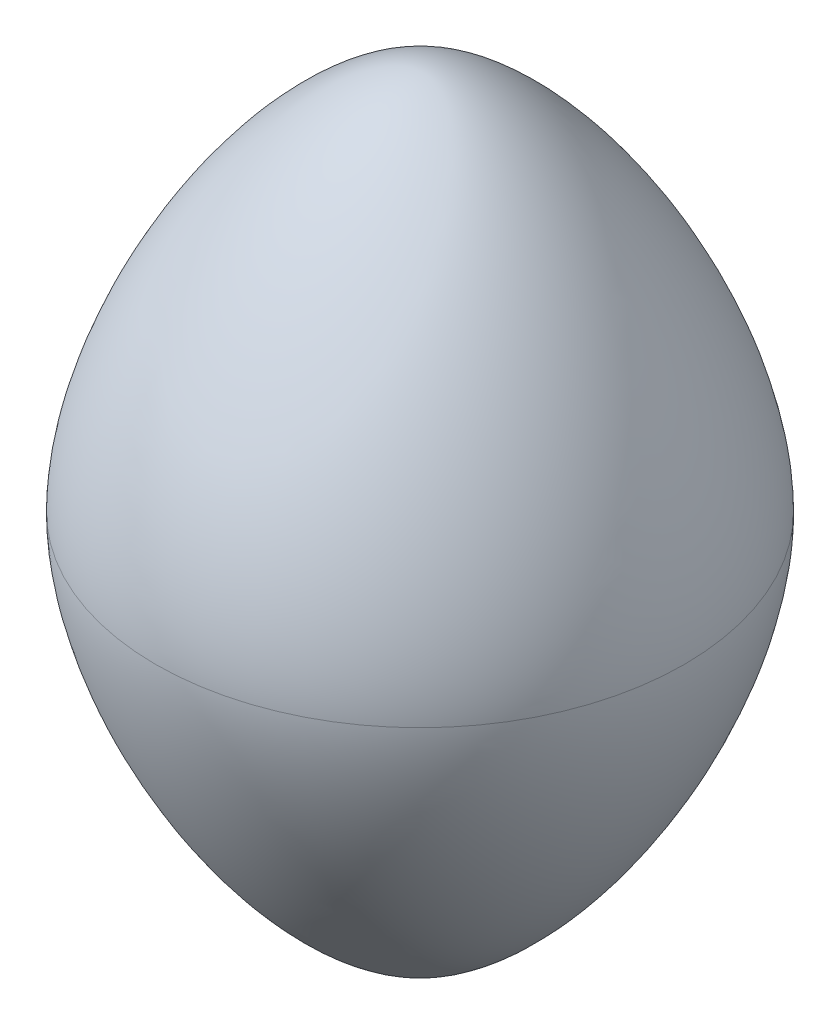
ISO-10303-21;
HEADER;
FILE_DESCRIPTION(('STEP AP214'),'2;1');
FILE_NAME('part.step','',(''),(''),'','','');
FILE_SCHEMA(('AUTOMOTIVE_DESIGN { 1 0 10303 214 1 1 1 1 }'));
ENDSEC;
DATA;
#1=APPLICATION_CONTEXT('core data for automotive mechanical design processes');
#2=APPLICATION_PROTOCOL_DEFINITION('international standard','automotive_design',2000,#1);
#3=PRODUCT_CONTEXT('',#1,'mechanical');
#4=PRODUCT('Part','Part','',(#3));
#5=PRODUCT_RELATED_PRODUCT_CATEGORY('part','',(#4));
#6=PRODUCT_DEFINITION_FORMATION('','',#4);
#7=PRODUCT_DEFINITION_CONTEXT('part definition',#1,'design');
#8=PRODUCT_DEFINITION('design','',#6,#7);
#9=PRODUCT_DEFINITION_SHAPE('','',#8);
#10=(LENGTH_UNIT() NAMED_UNIT(*) SI_UNIT(.MILLI.,.METRE.));
#11=(NAMED_UNIT(*) PLANE_ANGLE_UNIT() SI_UNIT($,.RADIAN.));
#12=(NAMED_UNIT(*) SI_UNIT($,.STERADIAN.) SOLID_ANGLE_UNIT());
#13=UNCERTAINTY_MEASURE_WITH_UNIT(LENGTH_MEASURE(1.E-05),#10,'distance_accuracy_value','');
#14=(GEOMETRIC_REPRESENTATION_CONTEXT(3) GLOBAL_UNCERTAINTY_ASSIGNED_CONTEXT((#13)) GLOBAL_UNIT_ASSIGNED_CONTEXT((#10,
#11,#12)) REPRESENTATION_CONTEXT('',''));
#15=CARTESIAN_POINT('',(0.,0.,0.));
#16=DIRECTION('',(0.,0.,1.));
#17=DIRECTION('',(1.,0.,0.));
#18=AXIS2_PLACEMENT_3D('',#15,#16,#17);
#19=CARTESIAN_POINT('',(21.5,0.,0.));
#20=CARTESIAN_POINT('',(21.5,31.,0.));
#21=CARTESIAN_POINT('',(0.,31.,0.));
#22=(BOUNDED_CURVE() B_SPLINE_CURVE(2,(#19,#20,#21),.UNSPECIFIED.,.F.,
.F.) B_SPLINE_CURVE_WITH_KNOTS((3,3),(0.,1.),
.UNSPECIFIED.) CURVE() GEOMETRIC_REPRESENTATION_ITEM() RATIONAL_B_SPLINE_CURVE((1.,
0.428571428571429,1.)) REPRESENTATION_ITEM(''));
#23=CARTESIAN_POINT('',(0.,31.,0.));
#24=DIRECTION('',(0.,1.,0.));
#25=AXIS1_PLACEMENT('',#23,#24);
#26=SURFACE_OF_REVOLUTION('',#22,#25);
#27=CARTESIAN_POINT('',(0.,31.,0.));
#28=VERTEX_POINT('',#27);
#29=VERTEX_LOOP('',#28);
#30=FACE_BOUND('',#29,.T.);
#31=CARTESIAN_POINT('',(0.,0.,0.));
#32=DIRECTION('',(0.,1.,0.));
#33=DIRECTION('',(0.,0.,1.));
#34=AXIS2_PLACEMENT_3D('',#31,#32,#33);
#35=CIRCLE('',#34,21.5);
#36=CARTESIAN_POINT('',(0.,0.,21.5));
#37=VERTEX_POINT('',#36);
#38=EDGE_CURVE('E11',#37,#37,#35,.T.);
#39=ORIENTED_EDGE('',*,*,#38,.T.);
#40=EDGE_LOOP('',(#39));
#41=FACE_BOUND('',#40,.T.);
#42=ADVANCED_FACE('F37',(#30,#41),#26,.T.);
#43=CARTESIAN_POINT('',(0.,-31.,0.));
#44=CARTESIAN_POINT('',(21.5,-31.,0.));
#45=CARTESIAN_POINT('',(21.5,0.,0.));
#46=(BOUNDED_CURVE() B_SPLINE_CURVE(2,(#43,#44,#45),.UNSPECIFIED.,.F.,
.F.) B_SPLINE_CURVE_WITH_KNOTS((3,3),(0.,1.),
.UNSPECIFIED.) CURVE() GEOMETRIC_REPRESENTATION_ITEM() RATIONAL_B_SPLINE_CURVE((1.,
0.428571428571429,1.)) REPRESENTATION_ITEM(''));
#47=CARTESIAN_POINT('',(0.,31.,0.));
#48=DIRECTION('',(0.,1.,0.));
#49=AXIS1_PLACEMENT('',#47,#48);
#50=SURFACE_OF_REVOLUTION('',#46,#49);
#51=ORIENTED_EDGE('',*,*,#38,.F.);
#52=EDGE_LOOP('',(#51));
#53=FACE_BOUND('',#52,.T.);
#54=CARTESIAN_POINT('',(0.,-31.,0.));
#55=VERTEX_POINT('',#54);
#56=VERTEX_LOOP('',#55);
#57=FACE_BOUND('',#56,.T.);
#58=ADVANCED_FACE('F52',(#53,#57),#50,.T.);
#59=CLOSED_SHELL('',(#42,#58));
#60=MANIFOLD_SOLID_BREP('B2',#59);
#61=ADVANCED_BREP_SHAPE_REPRESENTATION('',(#18,#60),#14);
#62=SHAPE_DEFINITION_REPRESENTATION(#9,#61);
ENDSEC;
END-ISO-10303-21;
